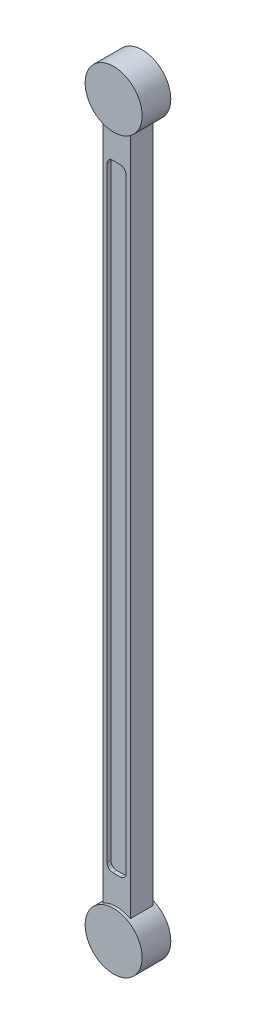
ISO-10303-21;
HEADER;
FILE_DESCRIPTION(('STEP AP214'),'2;1');
FILE_NAME('part.step','',(''),(''),'','','');
FILE_SCHEMA(('AUTOMOTIVE_DESIGN { 1 0 10303 214 1 1 1 1 }'));
ENDSEC;
DATA;
#1=APPLICATION_CONTEXT('core data for automotive mechanical design processes');
#2=APPLICATION_PROTOCOL_DEFINITION('international standard','automotive_design',2000,#1);
#3=PRODUCT_CONTEXT('',#1,'mechanical');
#4=PRODUCT('Part','Part','',(#3));
#5=PRODUCT_RELATED_PRODUCT_CATEGORY('part','',(#4));
#6=PRODUCT_DEFINITION_FORMATION('','',#4);
#7=PRODUCT_DEFINITION_CONTEXT('part definition',#1,'design');
#8=PRODUCT_DEFINITION('design','',#6,#7);
#9=PRODUCT_DEFINITION_SHAPE('','',#8);
#10=(LENGTH_UNIT() NAMED_UNIT(*) SI_UNIT(.MILLI.,.METRE.));
#11=(NAMED_UNIT(*) PLANE_ANGLE_UNIT() SI_UNIT($,.RADIAN.));
#12=(NAMED_UNIT(*) SI_UNIT($,.STERADIAN.) SOLID_ANGLE_UNIT());
#13=UNCERTAINTY_MEASURE_WITH_UNIT(LENGTH_MEASURE(1.E-05),#10,'distance_accuracy_value','');
#14=(GEOMETRIC_REPRESENTATION_CONTEXT(3) GLOBAL_UNCERTAINTY_ASSIGNED_CONTEXT((#13)) GLOBAL_UNIT_ASSIGNED_CONTEXT((#10,
#11,#12)) REPRESENTATION_CONTEXT('',''));
#15=CARTESIAN_POINT('',(0.,0.,0.));
#16=DIRECTION('',(0.,0.,1.));
#17=DIRECTION('',(1.,0.,0.));
#18=AXIS2_PLACEMENT_3D('',#15,#16,#17);
#19=CARTESIAN_POINT('',(0.,1219.99937354261,-19.0000000000001));
#20=DIRECTION('',(0.,0.,1.));
#21=DIRECTION('',(1.,0.,0.));
#22=AXIS2_PLACEMENT_3D('',#19,#20,#21);
#23=PLANE('',#22);
#24=DIRECTION('',(-1.,0.,0.));
#25=VECTOR('',#24,1.);
#26=CARTESIAN_POINT('',(6.23599999997874,93.9993735426106,-19.0000000000001));
#27=LINE('',#26,#25);
#28=CARTESIAN_POINT('',(6.23599999997874,93.9993735426106,-19.0000000000001));
#29=VERTEX_POINT('',#28);
#30=CARTESIAN_POINT('',(-6.23600000002361,93.9993735426106,-19.0000000000001));
#31=VERTEX_POINT('',#30);
#32=EDGE_CURVE('E206',#29,#31,#27,.T.);
#33=ORIENTED_EDGE('',*,*,#32,.F.);
#34=CARTESIAN_POINT('',(6.23599999997874,103.651373542611,-19.0000000000001));
#35=DIRECTION('',(0.,0.,-1.));
#36=DIRECTION('',(-1.,0.,0.));
#37=AXIS2_PLACEMENT_3D('',#34,#35,#36);
#38=CIRCLE('',#37,9.65199999999999);
#39=CARTESIAN_POINT('',(15.8879999999787,103.65137354261,-19.0000000000001));
#40=VERTEX_POINT('',#39);
#41=EDGE_CURVE('E54',#40,#29,#38,.T.);
#42=ORIENTED_EDGE('',*,*,#41,.F.);
#43=DIRECTION('',(0.,-1.,0.));
#44=VECTOR('',#43,1.);
#45=CARTESIAN_POINT('',(15.8879999999995,1116.34737354261,-19.0000000000001));
#46=LINE('',#45,#44);
#47=CARTESIAN_POINT('',(15.8879999999995,1116.34737354261,-19.0000000000001));
#48=VERTEX_POINT('',#47);
#49=EDGE_CURVE('E230',#48,#40,#46,.T.);
#50=ORIENTED_EDGE('',*,*,#49,.F.);
#51=CARTESIAN_POINT('',(6.23599999999932,1116.34737354261,-19.0000000000001));
#52=DIRECTION('',(0.,0.,-1.));
#53=DIRECTION('',(-1.,0.,0.));
#54=AXIS2_PLACEMENT_3D('',#51,#52,#53);
#55=CIRCLE('',#54,9.65200000000019);
#56=CARTESIAN_POINT('',(6.23599999999932,1125.99937354261,-19.0000000000001));
#57=VERTEX_POINT('',#56);
#58=EDGE_CURVE('E227',#57,#48,#55,.T.);
#59=ORIENTED_EDGE('',*,*,#58,.F.);
#60=DIRECTION('',(1.,0.,0.));
#61=VECTOR('',#60,1.);
#62=CARTESIAN_POINT('',(-6.23600000002362,1125.99937354261,-19.0000000000001));
#63=LINE('',#62,#61);
#64=CARTESIAN_POINT('',(-6.23600000002362,1125.99937354261,-19.0000000000001));
#65=VERTEX_POINT('',#64);
#66=EDGE_CURVE('E224',#65,#57,#63,.T.);
#67=ORIENTED_EDGE('',*,*,#66,.F.);
#68=CARTESIAN_POINT('',(-6.23600000002361,1116.34737354261,-19.0000000000001));
#69=DIRECTION('',(0.,0.,-1.));
#70=DIRECTION('',(-1.,0.,0.));
#71=AXIS2_PLACEMENT_3D('',#68,#69,#70);
#72=CIRCLE('',#71,9.652);
#73=CARTESIAN_POINT('',(-15.8880000000236,1116.34737354261,-19.0000000000001));
#74=VERTEX_POINT('',#73);
#75=EDGE_CURVE('E221',#74,#65,#72,.T.);
#76=ORIENTED_EDGE('',*,*,#75,.F.);
#77=DIRECTION('',(0.,1.,0.));
#78=VECTOR('',#77,1.);
#79=CARTESIAN_POINT('',(-15.8880000000236,103.651373542611,-19.0000000000001));
#80=LINE('',#79,#78);
#81=CARTESIAN_POINT('',(-15.8880000000236,103.651373542611,-19.0000000000001));
#82=VERTEX_POINT('',#81);
#83=EDGE_CURVE('E218',#82,#74,#80,.T.);
#84=ORIENTED_EDGE('',*,*,#83,.F.);
#85=CARTESIAN_POINT('',(-6.23600000002361,103.651373542611,-19.0000000000001));
#86=DIRECTION('',(0.,0.,-1.));
#87=DIRECTION('',(-1.,0.,0.));
#88=AXIS2_PLACEMENT_3D('',#85,#86,#87);
#89=CIRCLE('',#88,9.65199999999998);
#90=EDGE_CURVE('E215',#31,#82,#89,.T.);
#91=ORIENTED_EDGE('',*,*,#90,.F.);
#92=EDGE_LOOP('',(#33,#42,#50,#59,#67,#76,#84,#91));
#93=FACE_BOUND('',#92,.T.);
#94=CARTESIAN_POINT('',(0.,0.,-19.0000000000001));
#95=DIRECTION('',(0.,0.,1.));
#96=DIRECTION('',(1.,0.,0.));
#97=AXIS2_PLACEMENT_3D('',#94,#95,#96);
#98=CIRCLE('',#97,47.6571663267766);
#99=CARTESIAN_POINT('',(-23.0000000000236,41.7397352926078,-19.0000000000001));
#100=VERTEX_POINT('',#99);
#101=CARTESIAN_POINT('',(23.0000000000006,41.7397352926205,-19.0000000000001));
#102=VERTEX_POINT('',#101);
#103=EDGE_CURVE('E168',#100,#102,#98,.F.);
#104=ORIENTED_EDGE('',*,*,#103,.F.);
#105=DIRECTION('',(0.,-1.,0.));
#106=VECTOR('',#105,1.);
#107=CARTESIAN_POINT('',(-23.0000000000236,1178.25901179262,-19.0000000000001));
#108=LINE('',#107,#106);
#109=CARTESIAN_POINT('',(-23.0000000000236,1178.25901179262,-19.0000000000001));
#110=VERTEX_POINT('',#109);
#111=EDGE_CURVE('E177',#110,#100,#108,.T.);
#112=ORIENTED_EDGE('',*,*,#111,.F.);
#113=CARTESIAN_POINT('',(0.,1219.99937354261,-19.0000000000001));
#114=DIRECTION('',(0.,0.,1.));
#115=DIRECTION('',(1.,0.,0.));
#116=AXIS2_PLACEMENT_3D('',#113,#114,#115);
#117=CIRCLE('',#116,47.6577149999993);
#118=CARTESIAN_POINT('',(23.0000000000006,1178.25901179261,-19.0000000000001));
#119=VERTEX_POINT('',#118);
#120=EDGE_CURVE('E203',#119,#110,#117,.F.);
#121=ORIENTED_EDGE('',*,*,#120,.F.);
#122=DIRECTION('',(0.,1.,0.));
#123=VECTOR('',#122,1.);
#124=CARTESIAN_POINT('',(23.0000000000006,1178.25901179261,-19.0000000000001));
#125=LINE('',#124,#123);
#126=EDGE_CURVE('E178',#102,#119,#125,.T.);
#127=ORIENTED_EDGE('',*,*,#126,.F.);
#128=EDGE_LOOP('',(#104,#112,#121,#127));
#129=FACE_BOUND('',#128,.T.);
#130=ADVANCED_FACE('F32',(#93,#129),#23,.F.);
#131=CARTESIAN_POINT('',(0.,1219.99937354261,19.05));
#132=DIRECTION('',(0.,0.,1.));
#133=DIRECTION('',(1.,0.,0.));
#134=AXIS2_PLACEMENT_3D('',#131,#132,#133);
#135=PLANE('',#134);
#136=CARTESIAN_POINT('',(6.23599999997874,103.651373542611,19.05));
#137=DIRECTION('',(0.,0.,1.));
#138=DIRECTION('',(1.,0.,0.));
#139=AXIS2_PLACEMENT_3D('',#136,#137,#138);
#140=CIRCLE('',#139,9.65199999999999);
#141=CARTESIAN_POINT('',(6.23599999997874,93.9993735426106,19.05));
#142=VERTEX_POINT('',#141);
#143=CARTESIAN_POINT('',(15.8879999999787,103.65137354261,19.05));
#144=VERTEX_POINT('',#143);
#145=EDGE_CURVE('E260',#142,#144,#140,.T.);
#146=ORIENTED_EDGE('',*,*,#145,.F.);
#147=DIRECTION('',(1.,0.,0.));
#148=VECTOR('',#147,1.);
#149=CARTESIAN_POINT('',(-6.23600000002361,93.9993735426106,19.05));
#150=LINE('',#149,#148);
#151=CARTESIAN_POINT('',(-6.23600000002361,93.9993735426106,19.05));
#152=VERTEX_POINT('',#151);
#153=EDGE_CURVE('E293',#152,#142,#150,.T.);
#154=ORIENTED_EDGE('',*,*,#153,.F.);
#155=CARTESIAN_POINT('',(-6.23600000002361,103.651373542611,19.05));
#156=DIRECTION('',(0.,0.,1.));
#157=DIRECTION('',(-1.,0.,0.));
#158=AXIS2_PLACEMENT_3D('',#155,#156,#157);
#159=CIRCLE('',#158,9.65199999999999);
#160=CARTESIAN_POINT('',(-15.8880000000236,103.651373542611,19.05));
#161=VERTEX_POINT('',#160);
#162=EDGE_CURVE('E290',#161,#152,#159,.T.);
#163=ORIENTED_EDGE('',*,*,#162,.F.);
#164=DIRECTION('',(0.,-1.,0.));
#165=VECTOR('',#164,1.);
#166=CARTESIAN_POINT('',(-15.8880000000236,103.651373542611,19.05));
#167=LINE('',#166,#165);
#168=CARTESIAN_POINT('',(-15.8880000000236,1116.34737354261,19.05));
#169=VERTEX_POINT('',#168);
#170=EDGE_CURVE('E287',#169,#161,#167,.T.);
#171=ORIENTED_EDGE('',*,*,#170,.F.);
#172=CARTESIAN_POINT('',(-6.23600000002361,1116.34737354261,19.05));
#173=DIRECTION('',(0.,0.,1.));
#174=DIRECTION('',(1.,0.,0.));
#175=AXIS2_PLACEMENT_3D('',#172,#173,#174);
#176=CIRCLE('',#175,9.652);
#177=CARTESIAN_POINT('',(-6.23600000002361,1125.99937354261,19.05));
#178=VERTEX_POINT('',#177);
#179=EDGE_CURVE('E284',#178,#169,#176,.T.);
#180=ORIENTED_EDGE('',*,*,#179,.F.);
#181=DIRECTION('',(-1.,0.,0.));
#182=VECTOR('',#181,1.);
#183=CARTESIAN_POINT('',(-6.23600000002361,1125.99937354261,19.05));
#184=LINE('',#183,#182);
#185=CARTESIAN_POINT('',(6.23599999999932,1125.99937354261,19.05));
#186=VERTEX_POINT('',#185);
#187=EDGE_CURVE('E281',#186,#178,#184,.T.);
#188=ORIENTED_EDGE('',*,*,#187,.F.);
#189=CARTESIAN_POINT('',(6.23599999999932,1116.34737354261,19.05));
#190=DIRECTION('',(0.,0.,1.));
#191=DIRECTION('',(-1.,0.,0.));
#192=AXIS2_PLACEMENT_3D('',#189,#190,#191);
#193=CIRCLE('',#192,9.65200000000011);
#194=CARTESIAN_POINT('',(15.8879999999994,1116.34737354261,19.05));
#195=VERTEX_POINT('',#194);
#196=EDGE_CURVE('E278',#195,#186,#193,.T.);
#197=ORIENTED_EDGE('',*,*,#196,.F.);
#198=DIRECTION('',(0.,1.,0.));
#199=VECTOR('',#198,1.);
#200=CARTESIAN_POINT('',(15.8879999999993,1116.34737354261,19.05));
#201=LINE('',#200,#199);
#202=EDGE_CURVE('E275',#144,#195,#201,.T.);
#203=ORIENTED_EDGE('',*,*,#202,.F.);
#204=EDGE_LOOP('',(#146,#154,#163,#171,#180,#188,#197,#203));
#205=FACE_BOUND('',#204,.T.);
#206=DIRECTION('',(0.,-1.,0.));
#207=VECTOR('',#206,1.);
#208=CARTESIAN_POINT('',(-23.0000000000236,1178.25901179262,19.05));
#209=LINE('',#208,#207);
#210=CARTESIAN_POINT('',(-23.0000000000236,1178.25901179262,19.05));
#211=VERTEX_POINT('',#210);
#212=CARTESIAN_POINT('',(-23.0000000000236,41.7397352926079,19.05));
#213=VERTEX_POINT('',#212);
#214=EDGE_CURVE('E188',#211,#213,#209,.T.);
#215=ORIENTED_EDGE('',*,*,#214,.T.);
#216=CARTESIAN_POINT('',(0.,0.,19.05));
#217=DIRECTION('',(0.,0.,1.));
#218=DIRECTION('',(1.,0.,0.));
#219=AXIS2_PLACEMENT_3D('',#216,#217,#218);
#220=CIRCLE('',#219,47.6571663267766);
#221=CARTESIAN_POINT('',(23.0000000000006,41.7397352926205,19.05));
#222=VERTEX_POINT('',#221);
#223=EDGE_CURVE('E47',#213,#222,#220,.F.);
#224=ORIENTED_EDGE('',*,*,#223,.T.);
#225=DIRECTION('',(0.,1.,0.));
#226=VECTOR('',#225,1.);
#227=CARTESIAN_POINT('',(23.0000000000006,1178.25901179261,19.05));
#228=LINE('',#227,#226);
#229=CARTESIAN_POINT('',(23.0000000000006,1178.25901179261,19.05));
#230=VERTEX_POINT('',#229);
#231=EDGE_CURVE('E185',#222,#230,#228,.T.);
#232=ORIENTED_EDGE('',*,*,#231,.T.);
#233=CARTESIAN_POINT('',(0.,1219.99937354261,19.05));
#234=DIRECTION('',(0.,0.,1.));
#235=DIRECTION('',(1.,0.,0.));
#236=AXIS2_PLACEMENT_3D('',#233,#234,#235);
#237=CIRCLE('',#236,47.6577149999993);
#238=EDGE_CURVE('E40',#230,#211,#237,.F.);
#239=ORIENTED_EDGE('',*,*,#238,.T.);
#240=EDGE_LOOP('',(#215,#224,#232,#239));
#241=FACE_BOUND('',#240,.T.);
#242=ADVANCED_FACE('F198',(#205,#241),#135,.T.);
#243=CARTESIAN_POINT('',(23.0000000000006,1178.25901179261,-19.0000000000001));
#244=DIRECTION('',(1.,0.,0.));
#245=DIRECTION('',(0.,0.,-1.));
#246=AXIS2_PLACEMENT_3D('',#243,#244,#245);
#247=PLANE('',#246);
#248=ORIENTED_EDGE('',*,*,#231,.F.);
#249=DIRECTION('',(0.,0.,-1.));
#250=VECTOR('',#249,1.);
#251=CARTESIAN_POINT('',(23.0000000000006,41.7397352926205,23.876));
#252=LINE('',#251,#250);
#253=EDGE_CURVE('E179',#222,#102,#252,.T.);
#254=ORIENTED_EDGE('',*,*,#253,.T.);
#255=ORIENTED_EDGE('',*,*,#126,.T.);
#256=DIRECTION('',(0.,0.,1.));
#257=VECTOR('',#256,1.);
#258=CARTESIAN_POINT('',(23.0000000000006,1178.25901179261,-19.0000000000001));
#259=LINE('',#258,#257);
#260=EDGE_CURVE('E192',#119,#230,#259,.T.);
#261=ORIENTED_EDGE('',*,*,#260,.T.);
#262=EDGE_LOOP('',(#248,#254,#255,#261));
#263=FACE_BOUND('',#262,.T.);
#264=ADVANCED_FACE('F385',(#263),#247,.T.);
#265=CARTESIAN_POINT('',(-23.0000000000236,1178.25901179262,-19.0000000000001));
#266=DIRECTION('',(-1.,0.,0.));
#267=DIRECTION('',(0.,0.,1.));
#268=AXIS2_PLACEMENT_3D('',#265,#266,#267);
#269=PLANE('',#268);
#270=ORIENTED_EDGE('',*,*,#111,.T.);
#271=DIRECTION('',(0.,0.,-1.));
#272=VECTOR('',#271,1.);
#273=CARTESIAN_POINT('',(-23.0000000000236,41.7397352926078,23.876));
#274=LINE('',#273,#272);
#275=EDGE_CURVE('E11',#100,#213,#274,.F.);
#276=ORIENTED_EDGE('',*,*,#275,.T.);
#277=ORIENTED_EDGE('',*,*,#214,.F.);
#278=DIRECTION('',(0.,0.,1.));
#279=VECTOR('',#278,1.);
#280=CARTESIAN_POINT('',(-23.0000000000236,1178.25901179262,-19.0000000000001));
#281=LINE('',#280,#279);
#282=EDGE_CURVE('E184',#110,#211,#281,.T.);
#283=ORIENTED_EDGE('',*,*,#282,.F.);
#284=EDGE_LOOP('',(#270,#276,#277,#283));
#285=FACE_BOUND('',#284,.T.);
#286=ADVANCED_FACE('F182',(#285),#269,.T.);
#287=CARTESIAN_POINT('',(0.,1219.99937354261,-19.0000000000001));
#288=DIRECTION('',(0.,0.,1.));
#289=DIRECTION('',(1.,0.,0.));
#290=AXIS2_PLACEMENT_3D('',#287,#288,#289);
#291=CYLINDRICAL_SURFACE('',#290,47.6577149999993);
#292=ORIENTED_EDGE('',*,*,#282,.T.);
#293=ORIENTED_EDGE('',*,*,#238,.F.);
#294=ORIENTED_EDGE('',*,*,#260,.F.);
#295=ORIENTED_EDGE('',*,*,#120,.T.);
#296=EDGE_LOOP('',(#292,#293,#294,#295));
#297=FACE_BOUND('',#296,.T.);
#298=CARTESIAN_POINT('',(0.,1219.99937354261,23.876));
#299=DIRECTION('',(0.,0.,1.));
#300=DIRECTION('',(1.,0.,0.));
#301=AXIS2_PLACEMENT_3D('',#298,#299,#300);
#302=CIRCLE('',#301,47.6577149999993);
#303=CARTESIAN_POINT('',(47.6577149999993,1219.99937354261,23.876));
#304=VERTEX_POINT('',#303);
#305=EDGE_CURVE('E204',#304,#304,#302,.T.);
#306=ORIENTED_EDGE('',*,*,#305,.F.);
#307=EDGE_LOOP('',(#306));
#308=FACE_BOUND('',#307,.T.);
#309=CARTESIAN_POINT('',(0.,1219.99937354261,-24.13));
#310=DIRECTION('',(0.,0.,1.));
#311=DIRECTION('',(1.,0.,0.));
#312=AXIS2_PLACEMENT_3D('',#309,#310,#311);
#313=CIRCLE('',#312,47.6577149999993);
#314=CARTESIAN_POINT('',(47.6577149999993,1219.99937354261,-24.13));
#315=VERTEX_POINT('',#314);
#316=EDGE_CURVE('E209',#315,#315,#313,.T.);
#317=ORIENTED_EDGE('',*,*,#316,.T.);
#318=EDGE_LOOP('',(#317));
#319=FACE_BOUND('',#318,.T.);
#320=ADVANCED_FACE('F34',(#297,#308,#319),#291,.T.);
#321=CARTESIAN_POINT('',(6.23599999997874,103.651373542611,12.7));
#322=DIRECTION('',(0.,0.,1.));
#323=DIRECTION('',(1.,0.,0.));
#324=AXIS2_PLACEMENT_3D('',#321,#322,#323);
#325=CYLINDRICAL_SURFACE('',#324,9.65199999999999);
#326=ORIENTED_EDGE('',*,*,#145,.T.);
#327=DIRECTION('',(0.,0.,1.));
#328=VECTOR('',#327,1.);
#329=CARTESIAN_POINT('',(15.8879999999787,103.65137354261,12.7));
#330=LINE('',#329,#328);
#331=CARTESIAN_POINT('',(15.8879999999787,103.65137354261,12.7));
#332=VERTEX_POINT('',#331);
#333=EDGE_CURVE('E320',#332,#144,#330,.T.);
#334=ORIENTED_EDGE('',*,*,#333,.F.);
#335=CARTESIAN_POINT('',(6.23599999997874,103.651373542611,12.7));
#336=DIRECTION('',(0.,0.,1.));
#337=DIRECTION('',(1.,0.,0.));
#338=AXIS2_PLACEMENT_3D('',#335,#336,#337);
#339=CIRCLE('',#338,9.65199999999999);
#340=CARTESIAN_POINT('',(6.23599999997874,93.9993735426106,12.7));
#341=VERTEX_POINT('',#340);
#342=EDGE_CURVE('E296',#341,#332,#339,.T.);
#343=ORIENTED_EDGE('',*,*,#342,.F.);
#344=DIRECTION('',(0.,0.,1.));
#345=VECTOR('',#344,1.);
#346=CARTESIAN_POINT('',(6.23599999997874,93.9993735426106,12.7));
#347=LINE('',#346,#345);
#348=EDGE_CURVE('E321',#341,#142,#347,.T.);
#349=ORIENTED_EDGE('',*,*,#348,.T.);
#350=EDGE_LOOP('',(#326,#334,#343,#349));
#351=FACE_BOUND('',#350,.T.);
#352=ADVANCED_FACE('F355',(#351),#325,.F.);
#353=CARTESIAN_POINT('',(-6.23600000002361,93.9993735426106,12.7));
#354=DIRECTION('',(0.,-1.,0.));
#355=DIRECTION('',(1.,0.,0.));
#356=AXIS2_PLACEMENT_3D('',#353,#354,#355);
#357=PLANE('',#356);
#358=ORIENTED_EDGE('',*,*,#153,.T.);
#359=ORIENTED_EDGE('',*,*,#348,.F.);
#360=DIRECTION('',(1.,0.,0.));
#361=VECTOR('',#360,1.);
#362=CARTESIAN_POINT('',(-6.23600000002361,93.9993735426106,12.7));
#363=LINE('',#362,#361);
#364=CARTESIAN_POINT('',(-6.23600000002361,93.9993735426106,12.7));
#365=VERTEX_POINT('',#364);
#366=EDGE_CURVE('E317',#365,#341,#363,.T.);
#367=ORIENTED_EDGE('',*,*,#366,.F.);
#368=DIRECTION('',(0.,0.,1.));
#369=VECTOR('',#368,1.);
#370=CARTESIAN_POINT('',(-6.23600000002361,93.9993735426106,12.7));
#371=LINE('',#370,#369);
#372=EDGE_CURVE('E323',#365,#152,#371,.T.);
#373=ORIENTED_EDGE('',*,*,#372,.T.);
#374=EDGE_LOOP('',(#358,#359,#367,#373));
#375=FACE_BOUND('',#374,.T.);
#376=ADVANCED_FACE('F357',(#375),#357,.F.);
#377=CARTESIAN_POINT('',(-6.23600000002361,103.651373542611,12.7));
#378=DIRECTION('',(0.,0.,1.));
#379=DIRECTION('',(1.,0.,0.));
#380=AXIS2_PLACEMENT_3D('',#377,#378,#379);
#381=CYLINDRICAL_SURFACE('',#380,9.65199999999999);
#382=ORIENTED_EDGE('',*,*,#162,.T.);
#383=ORIENTED_EDGE('',*,*,#372,.F.);
#384=CARTESIAN_POINT('',(-6.23600000002361,103.651373542611,12.7));
#385=DIRECTION('',(0.,0.,1.));
#386=DIRECTION('',(-1.,0.,0.));
#387=AXIS2_PLACEMENT_3D('',#384,#385,#386);
#388=CIRCLE('',#387,9.65199999999999);
#389=CARTESIAN_POINT('',(-15.8880000000236,103.651373542611,12.7));
#390=VERTEX_POINT('',#389);
#391=EDGE_CURVE('E314',#390,#365,#388,.T.);
#392=ORIENTED_EDGE('',*,*,#391,.F.);
#393=DIRECTION('',(0.,0.,1.));
#394=VECTOR('',#393,1.);
#395=CARTESIAN_POINT('',(-15.8880000000236,103.651373542611,12.7));
#396=LINE('',#395,#394);
#397=EDGE_CURVE('E325',#390,#161,#396,.T.);
#398=ORIENTED_EDGE('',*,*,#397,.T.);
#399=EDGE_LOOP('',(#382,#383,#392,#398));
#400=FACE_BOUND('',#399,.T.);
#401=ADVANCED_FACE('F361',(#400),#381,.F.);
#402=CARTESIAN_POINT('',(-15.8880000000236,103.651373542611,12.7));
#403=DIRECTION('',(-1.,0.,0.));
#404=DIRECTION('',(0.,0.,1.));
#405=AXIS2_PLACEMENT_3D('',#402,#403,#404);
#406=PLANE('',#405);
#407=ORIENTED_EDGE('',*,*,#170,.T.);
#408=ORIENTED_EDGE('',*,*,#397,.F.);
#409=DIRECTION('',(0.,-1.,0.));
#410=VECTOR('',#409,1.);
#411=CARTESIAN_POINT('',(-15.8880000000236,103.651373542611,12.7));
#412=LINE('',#411,#410);
#413=CARTESIAN_POINT('',(-15.8880000000236,1116.34737354261,12.7));
#414=VERTEX_POINT('',#413);
#415=EDGE_CURVE('E311',#414,#390,#412,.T.);
#416=ORIENTED_EDGE('',*,*,#415,.F.);
#417=DIRECTION('',(0.,0.,1.));
#418=VECTOR('',#417,1.);
#419=CARTESIAN_POINT('',(-15.8880000000236,1116.34737354261,12.7));
#420=LINE('',#419,#418);
#421=EDGE_CURVE('E327',#414,#169,#420,.T.);
#422=ORIENTED_EDGE('',*,*,#421,.T.);
#423=EDGE_LOOP('',(#407,#408,#416,#422));
#424=FACE_BOUND('',#423,.T.);
#425=ADVANCED_FACE('F365',(#424),#406,.F.);
#426=CARTESIAN_POINT('',(-6.23600000002361,1116.34737354261,12.7));
#427=DIRECTION('',(0.,0.,1.));
#428=DIRECTION('',(1.,0.,0.));
#429=AXIS2_PLACEMENT_3D('',#426,#427,#428);
#430=CYLINDRICAL_SURFACE('',#429,9.652);
#431=ORIENTED_EDGE('',*,*,#179,.T.);
#432=ORIENTED_EDGE('',*,*,#421,.F.);
#433=CARTESIAN_POINT('',(-6.23600000002361,1116.34737354261,12.7));
#434=DIRECTION('',(0.,0.,1.));
#435=DIRECTION('',(1.,0.,0.));
#436=AXIS2_PLACEMENT_3D('',#433,#434,#435);
#437=CIRCLE('',#436,9.652);
#438=CARTESIAN_POINT('',(-6.23600000002361,1125.99937354261,12.7));
#439=VERTEX_POINT('',#438);
#440=EDGE_CURVE('E308',#439,#414,#437,.T.);
#441=ORIENTED_EDGE('',*,*,#440,.F.);
#442=DIRECTION('',(0.,0.,1.));
#443=VECTOR('',#442,1.);
#444=CARTESIAN_POINT('',(-6.23600000002361,1125.99937354261,12.7));
#445=LINE('',#444,#443);
#446=EDGE_CURVE('E329',#439,#178,#445,.T.);
#447=ORIENTED_EDGE('',*,*,#446,.T.);
#448=EDGE_LOOP('',(#431,#432,#441,#447));
#449=FACE_BOUND('',#448,.T.);
#450=ADVANCED_FACE('F368',(#449),#430,.F.);
#451=CARTESIAN_POINT('',(-6.23600000002361,1125.99937354261,12.7));
#452=DIRECTION('',(0.,1.,0.));
#453=DIRECTION('',(-1.,0.,0.));
#454=AXIS2_PLACEMENT_3D('',#451,#452,#453);
#455=PLANE('',#454);
#456=ORIENTED_EDGE('',*,*,#187,.T.);
#457=ORIENTED_EDGE('',*,*,#446,.F.);
#458=DIRECTION('',(-1.,0.,0.));
#459=VECTOR('',#458,1.);
#460=CARTESIAN_POINT('',(-6.23600000002361,1125.99937354261,12.7));
#461=LINE('',#460,#459);
#462=CARTESIAN_POINT('',(6.23599999999932,1125.99937354261,12.7));
#463=VERTEX_POINT('',#462);
#464=EDGE_CURVE('E305',#463,#439,#461,.T.);
#465=ORIENTED_EDGE('',*,*,#464,.F.);
#466=DIRECTION('',(0.,0.,1.));
#467=VECTOR('',#466,1.);
#468=CARTESIAN_POINT('',(6.23599999999932,1125.99937354261,12.7));
#469=LINE('',#468,#467);
#470=EDGE_CURVE('E331',#463,#186,#469,.T.);
#471=ORIENTED_EDGE('',*,*,#470,.T.);
#472=EDGE_LOOP('',(#456,#457,#465,#471));
#473=FACE_BOUND('',#472,.T.);
#474=ADVANCED_FACE('F370',(#473),#455,.F.);
#475=CARTESIAN_POINT('',(6.23599999999932,1116.34737354261,12.7));
#476=DIRECTION('',(0.,0.,1.));
#477=DIRECTION('',(1.,0.,0.));
#478=AXIS2_PLACEMENT_3D('',#475,#476,#477);
#479=CYLINDRICAL_SURFACE('',#478,9.65200000000011);
#480=ORIENTED_EDGE('',*,*,#196,.T.);
#481=ORIENTED_EDGE('',*,*,#470,.F.);
#482=CARTESIAN_POINT('',(6.23599999999932,1116.34737354261,12.7));
#483=DIRECTION('',(0.,0.,1.));
#484=DIRECTION('',(-1.,0.,0.));
#485=AXIS2_PLACEMENT_3D('',#482,#483,#484);
#486=CIRCLE('',#485,9.65200000000011);
#487=CARTESIAN_POINT('',(15.8879999999994,1116.34737354261,12.7));
#488=VERTEX_POINT('',#487);
#489=EDGE_CURVE('E302',#488,#463,#486,.T.);
#490=ORIENTED_EDGE('',*,*,#489,.F.);
#491=DIRECTION('',(0.,0.,1.));
#492=VECTOR('',#491,1.);
#493=CARTESIAN_POINT('',(15.8879999999994,1116.34737354261,12.7));
#494=LINE('',#493,#492);
#495=EDGE_CURVE('E333',#488,#195,#494,.T.);
#496=ORIENTED_EDGE('',*,*,#495,.T.);
#497=EDGE_LOOP('',(#480,#481,#490,#496));
#498=FACE_BOUND('',#497,.T.);
#499=ADVANCED_FACE('F349',(#498),#479,.F.);
#500=CARTESIAN_POINT('',(15.8879999999993,1116.34737354261,12.7));
#501=DIRECTION('',(1.,0.,0.));
#502=DIRECTION('',(0.,1.,0.));
#503=AXIS2_PLACEMENT_3D('',#500,#501,#502);
#504=PLANE('',#503);
#505=ORIENTED_EDGE('',*,*,#202,.T.);
#506=ORIENTED_EDGE('',*,*,#495,.F.);
#507=DIRECTION('',(0.,1.,0.));
#508=VECTOR('',#507,1.);
#509=CARTESIAN_POINT('',(15.8879999999993,1116.34737354261,12.7));
#510=LINE('',#509,#508);
#511=EDGE_CURVE('E299',#332,#488,#510,.T.);
#512=ORIENTED_EDGE('',*,*,#511,.F.);
#513=ORIENTED_EDGE('',*,*,#333,.T.);
#514=EDGE_LOOP('',(#505,#506,#512,#513));
#515=FACE_BOUND('',#514,.T.);
#516=ADVANCED_FACE('F339',(#515),#504,.F.);
#517=CARTESIAN_POINT('',(6.23599999997874,103.651373542611,12.7));
#518=DIRECTION('',(0.,0.,1.));
#519=DIRECTION('',(1.,0.,0.));
#520=AXIS2_PLACEMENT_3D('',#517,#518,#519);
#521=PLANE('',#520);
#522=ORIENTED_EDGE('',*,*,#342,.T.);
#523=ORIENTED_EDGE('',*,*,#511,.T.);
#524=ORIENTED_EDGE('',*,*,#489,.T.);
#525=ORIENTED_EDGE('',*,*,#464,.T.);
#526=ORIENTED_EDGE('',*,*,#440,.T.);
#527=ORIENTED_EDGE('',*,*,#415,.T.);
#528=ORIENTED_EDGE('',*,*,#391,.T.);
#529=ORIENTED_EDGE('',*,*,#366,.T.);
#530=EDGE_LOOP('',(#522,#523,#524,#525,#526,#527,#528,#529));
#531=FACE_BOUND('',#530,.T.);
#532=ADVANCED_FACE('F353',(#531),#521,.T.);
#533=CARTESIAN_POINT('',(6.23599999997874,103.651373542611,-12.6500000000001));
#534=DIRECTION('',(0.,0.,-1.));
#535=DIRECTION('',(-1.,0.,0.));
#536=AXIS2_PLACEMENT_3D('',#533,#534,#535);
#537=CYLINDRICAL_SURFACE('',#536,9.65199999999999);
#538=ORIENTED_EDGE('',*,*,#41,.T.);
#539=DIRECTION('',(0.,0.,-1.));
#540=VECTOR('',#539,1.);
#541=CARTESIAN_POINT('',(6.23599999997874,93.9993735426106,-12.6500000000001));
#542=LINE('',#541,#540);
#543=CARTESIAN_POINT('',(6.23599999997874,93.9993735426106,-12.6500000000001));
#544=VERTEX_POINT('',#543);
#545=EDGE_CURVE('E257',#544,#29,#542,.T.);
#546=ORIENTED_EDGE('',*,*,#545,.F.);
#547=CARTESIAN_POINT('',(6.23599999997874,103.651373542611,-12.6500000000001));
#548=DIRECTION('',(0.,0.,-1.));
#549=DIRECTION('',(-1.,0.,0.));
#550=AXIS2_PLACEMENT_3D('',#547,#548,#549);
#551=CIRCLE('',#550,9.65199999999999);
#552=CARTESIAN_POINT('',(15.8879999999787,103.65137354261,-12.6500000000001));
#553=VERTEX_POINT('',#552);
#554=EDGE_CURVE('E233',#553,#544,#551,.T.);
#555=ORIENTED_EDGE('',*,*,#554,.F.);
#556=DIRECTION('',(0.,0.,-1.));
#557=VECTOR('',#556,1.);
#558=CARTESIAN_POINT('',(15.8879999999787,103.65137354261,-12.6500000000001));
#559=LINE('',#558,#557);
#560=EDGE_CURVE('E258',#553,#40,#559,.T.);
#561=ORIENTED_EDGE('',*,*,#560,.T.);
#562=EDGE_LOOP('',(#538,#546,#555,#561));
#563=FACE_BOUND('',#562,.T.);
#564=ADVANCED_FACE('F408',(#563),#537,.F.);
#565=CARTESIAN_POINT('',(15.8879999999995,1116.34737354261,-12.6500000000001));
#566=DIRECTION('',(1.,0.,0.));
#567=DIRECTION('',(0.,1.,0.));
#568=AXIS2_PLACEMENT_3D('',#565,#566,#567);
#569=PLANE('',#568);
#570=ORIENTED_EDGE('',*,*,#49,.T.);
#571=ORIENTED_EDGE('',*,*,#560,.F.);
#572=DIRECTION('',(0.,-1.,0.));
#573=VECTOR('',#572,1.);
#574=CARTESIAN_POINT('',(15.8879999999995,1116.34737354261,-12.6500000000001));
#575=LINE('',#574,#573);
#576=CARTESIAN_POINT('',(15.8879999999995,1116.34737354261,-12.6500000000001));
#577=VERTEX_POINT('',#576);
#578=EDGE_CURVE('E254',#577,#553,#575,.T.);
#579=ORIENTED_EDGE('',*,*,#578,.F.);
#580=DIRECTION('',(0.,0.,-1.));
#581=VECTOR('',#580,1.);
#582=CARTESIAN_POINT('',(15.8879999999995,1116.34737354261,-12.6500000000001));
#583=LINE('',#582,#581);
#584=EDGE_CURVE('E261',#577,#48,#583,.T.);
#585=ORIENTED_EDGE('',*,*,#584,.T.);
#586=EDGE_LOOP('',(#570,#571,#579,#585));
#587=FACE_BOUND('',#586,.T.);
#588=ADVANCED_FACE('F413',(#587),#569,.F.);
#589=CARTESIAN_POINT('',(6.23599999999932,1116.34737354261,-12.6500000000001));
#590=DIRECTION('',(0.,0.,-1.));
#591=DIRECTION('',(-1.,0.,0.));
#592=AXIS2_PLACEMENT_3D('',#589,#590,#591);
#593=CYLINDRICAL_SURFACE('',#592,9.65200000000019);
#594=ORIENTED_EDGE('',*,*,#58,.T.);
#595=ORIENTED_EDGE('',*,*,#584,.F.);
#596=CARTESIAN_POINT('',(6.23599999999932,1116.34737354261,-12.6500000000001));
#597=DIRECTION('',(0.,0.,-1.));
#598=DIRECTION('',(-1.,0.,0.));
#599=AXIS2_PLACEMENT_3D('',#596,#597,#598);
#600=CIRCLE('',#599,9.65200000000019);
#601=CARTESIAN_POINT('',(6.23599999999932,1125.99937354261,-12.6500000000001));
#602=VERTEX_POINT('',#601);
#603=EDGE_CURVE('E251',#602,#577,#600,.T.);
#604=ORIENTED_EDGE('',*,*,#603,.F.);
#605=DIRECTION('',(0.,0.,-1.));
#606=VECTOR('',#605,1.);
#607=CARTESIAN_POINT('',(6.23599999999932,1125.99937354261,-12.6500000000001));
#608=LINE('',#607,#606);
#609=EDGE_CURVE('E263',#602,#57,#608,.T.);
#610=ORIENTED_EDGE('',*,*,#609,.T.);
#611=EDGE_LOOP('',(#594,#595,#604,#610));
#612=FACE_BOUND('',#611,.T.);
#613=ADVANCED_FACE('F461',(#612),#593,.F.);
#614=CARTESIAN_POINT('',(-6.23600000002362,1125.99937354261,-12.6500000000001));
#615=DIRECTION('',(0.,1.,0.));
#616=DIRECTION('',(-1.,0.,0.));
#617=AXIS2_PLACEMENT_3D('',#614,#615,#616);
#618=PLANE('',#617);
#619=ORIENTED_EDGE('',*,*,#66,.T.);
#620=ORIENTED_EDGE('',*,*,#609,.F.);
#621=DIRECTION('',(1.,0.,0.));
#622=VECTOR('',#621,1.);
#623=CARTESIAN_POINT('',(-6.23600000002362,1125.99937354261,-12.6500000000001));
#624=LINE('',#623,#622);
#625=CARTESIAN_POINT('',(-6.23600000002362,1125.99937354261,-12.6500000000001));
#626=VERTEX_POINT('',#625);
#627=EDGE_CURVE('E248',#626,#602,#624,.T.);
#628=ORIENTED_EDGE('',*,*,#627,.F.);
#629=DIRECTION('',(0.,0.,-1.));
#630=VECTOR('',#629,1.);
#631=CARTESIAN_POINT('',(-6.23600000002362,1125.99937354261,-12.6500000000001));
#632=LINE('',#631,#630);
#633=EDGE_CURVE('E265',#626,#65,#632,.T.);
#634=ORIENTED_EDGE('',*,*,#633,.T.);
#635=EDGE_LOOP('',(#619,#620,#628,#634));
#636=FACE_BOUND('',#635,.T.);
#637=ADVANCED_FACE('F471',(#636),#618,.F.);
#638=CARTESIAN_POINT('',(-6.23600000002361,1116.34737354261,-12.6500000000001));
#639=DIRECTION('',(0.,0.,-1.));
#640=DIRECTION('',(-1.,0.,0.));
#641=AXIS2_PLACEMENT_3D('',#638,#639,#640);
#642=CYLINDRICAL_SURFACE('',#641,9.652);
#643=ORIENTED_EDGE('',*,*,#75,.T.);
#644=ORIENTED_EDGE('',*,*,#633,.F.);
#645=CARTESIAN_POINT('',(-6.23600000002361,1116.34737354261,-12.6500000000001));
#646=DIRECTION('',(0.,0.,-1.));
#647=DIRECTION('',(-1.,0.,0.));
#648=AXIS2_PLACEMENT_3D('',#645,#646,#647);
#649=CIRCLE('',#648,9.652);
#650=CARTESIAN_POINT('',(-15.8880000000236,1116.34737354261,-12.6500000000001));
#651=VERTEX_POINT('',#650);
#652=EDGE_CURVE('E245',#651,#626,#649,.T.);
#653=ORIENTED_EDGE('',*,*,#652,.F.);
#654=DIRECTION('',(0.,0.,-1.));
#655=VECTOR('',#654,1.);
#656=CARTESIAN_POINT('',(-15.8880000000236,1116.34737354261,-12.6500000000001));
#657=LINE('',#656,#655);
#658=EDGE_CURVE('E267',#651,#74,#657,.T.);
#659=ORIENTED_EDGE('',*,*,#658,.T.);
#660=EDGE_LOOP('',(#643,#644,#653,#659));
#661=FACE_BOUND('',#660,.T.);
#662=ADVANCED_FACE('F481',(#661),#642,.F.);
#663=CARTESIAN_POINT('',(-15.8880000000236,103.651373542611,-12.6500000000001));
#664=DIRECTION('',(-1.,0.,0.));
#665=DIRECTION('',(0.,-1.,0.));
#666=AXIS2_PLACEMENT_3D('',#663,#664,#665);
#667=PLANE('',#666);
#668=ORIENTED_EDGE('',*,*,#83,.T.);
#669=ORIENTED_EDGE('',*,*,#658,.F.);
#670=DIRECTION('',(0.,1.,0.));
#671=VECTOR('',#670,1.);
#672=CARTESIAN_POINT('',(-15.8880000000236,103.651373542611,-12.6500000000001));
#673=LINE('',#672,#671);
#674=CARTESIAN_POINT('',(-15.8880000000236,103.651373542611,-12.6500000000001));
#675=VERTEX_POINT('',#674);
#676=EDGE_CURVE('E242',#675,#651,#673,.T.);
#677=ORIENTED_EDGE('',*,*,#676,.F.);
#678=DIRECTION('',(0.,0.,-1.));
#679=VECTOR('',#678,1.);
#680=CARTESIAN_POINT('',(-15.8880000000236,103.651373542611,-12.6500000000001));
#681=LINE('',#680,#679);
#682=EDGE_CURVE('E269',#675,#82,#681,.T.);
#683=ORIENTED_EDGE('',*,*,#682,.T.);
#684=EDGE_LOOP('',(#668,#669,#677,#683));
#685=FACE_BOUND('',#684,.T.);
#686=ADVANCED_FACE('F491',(#685),#667,.F.);
#687=CARTESIAN_POINT('',(-6.23600000002361,103.651373542611,-12.6500000000001));
#688=DIRECTION('',(0.,0.,-1.));
#689=DIRECTION('',(-1.,0.,0.));
#690=AXIS2_PLACEMENT_3D('',#687,#688,#689);
#691=CYLINDRICAL_SURFACE('',#690,9.65199999999998);
#692=ORIENTED_EDGE('',*,*,#90,.T.);
#693=ORIENTED_EDGE('',*,*,#682,.F.);
#694=CARTESIAN_POINT('',(-6.23600000002361,103.651373542611,-12.6500000000001));
#695=DIRECTION('',(0.,0.,-1.));
#696=DIRECTION('',(-1.,0.,0.));
#697=AXIS2_PLACEMENT_3D('',#694,#695,#696);
#698=CIRCLE('',#697,9.65199999999998);
#699=CARTESIAN_POINT('',(-6.23600000002361,93.9993735426106,-12.6500000000001));
#700=VERTEX_POINT('',#699);
#701=EDGE_CURVE('E239',#700,#675,#698,.T.);
#702=ORIENTED_EDGE('',*,*,#701,.F.);
#703=DIRECTION('',(0.,0.,-1.));
#704=VECTOR('',#703,1.);
#705=CARTESIAN_POINT('',(-6.23600000002361,93.9993735426106,-12.6500000000001));
#706=LINE('',#705,#704);
#707=EDGE_CURVE('E271',#700,#31,#706,.T.);
#708=ORIENTED_EDGE('',*,*,#707,.T.);
#709=EDGE_LOOP('',(#692,#693,#702,#708));
#710=FACE_BOUND('',#709,.T.);
#711=ADVANCED_FACE('F501',(#710),#691,.F.);
#712=CARTESIAN_POINT('',(6.23599999997874,93.9993735426106,-12.6500000000001));
#713=DIRECTION('',(0.,-1.,0.));
#714=DIRECTION('',(1.,0.,0.));
#715=AXIS2_PLACEMENT_3D('',#712,#713,#714);
#716=PLANE('',#715);
#717=ORIENTED_EDGE('',*,*,#32,.T.);
#718=ORIENTED_EDGE('',*,*,#707,.F.);
#719=DIRECTION('',(-1.,0.,0.));
#720=VECTOR('',#719,1.);
#721=CARTESIAN_POINT('',(6.23599999997874,93.9993735426106,-12.6500000000001));
#722=LINE('',#721,#720);
#723=EDGE_CURVE('E236',#544,#700,#722,.T.);
#724=ORIENTED_EDGE('',*,*,#723,.F.);
#725=ORIENTED_EDGE('',*,*,#545,.T.);
#726=EDGE_LOOP('',(#717,#718,#724,#725));
#727=FACE_BOUND('',#726,.T.);
#728=ADVANCED_FACE('F511',(#727),#716,.F.);
#729=CARTESIAN_POINT('',(6.23599999997874,103.651373542611,-12.6500000000001));
#730=DIRECTION('',(0.,0.,-1.));
#731=DIRECTION('',(-1.,0.,0.));
#732=AXIS2_PLACEMENT_3D('',#729,#730,#731);
#733=PLANE('',#732);
#734=ORIENTED_EDGE('',*,*,#554,.T.);
#735=ORIENTED_EDGE('',*,*,#723,.T.);
#736=ORIENTED_EDGE('',*,*,#701,.T.);
#737=ORIENTED_EDGE('',*,*,#676,.T.);
#738=ORIENTED_EDGE('',*,*,#652,.T.);
#739=ORIENTED_EDGE('',*,*,#627,.T.);
#740=ORIENTED_EDGE('',*,*,#603,.T.);
#741=ORIENTED_EDGE('',*,*,#578,.T.);
#742=EDGE_LOOP('',(#734,#735,#736,#737,#738,#739,#740,#741));
#743=FACE_BOUND('',#742,.T.);
#744=ADVANCED_FACE('F521',(#743),#733,.T.);
#745=CARTESIAN_POINT('',(0.,1219.99937354261,23.876));
#746=DIRECTION('',(0.,0.,1.));
#747=DIRECTION('',(1.,0.,0.));
#748=AXIS2_PLACEMENT_3D('',#745,#746,#747);
#749=PLANE('',#748);
#750=ORIENTED_EDGE('',*,*,#305,.T.);
#751=EDGE_LOOP('',(#750));
#752=FACE_BOUND('',#751,.T.);
#753=ADVANCED_FACE('F529',(#752),#749,.T.);
#754=CARTESIAN_POINT('',(0.,1219.99937354261,-24.13));
#755=DIRECTION('',(0.,0.,1.));
#756=DIRECTION('',(1.,0.,0.));
#757=AXIS2_PLACEMENT_3D('',#754,#755,#756);
#758=PLANE('',#757);
#759=ORIENTED_EDGE('',*,*,#316,.F.);
#760=EDGE_LOOP('',(#759));
#761=FACE_BOUND('',#760,.T.);
#762=ADVANCED_FACE('F565',(#761),#758,.F.);
#763=CARTESIAN_POINT('',(0.,0.,23.876));
#764=DIRECTION('',(0.,0.,-1.));
#765=DIRECTION('',(-1.,0.,0.));
#766=AXIS2_PLACEMENT_3D('',#763,#764,#765);
#767=CYLINDRICAL_SURFACE('',#766,47.6571663267766);
#768=ORIENTED_EDGE('',*,*,#253,.F.);
#769=ORIENTED_EDGE('',*,*,#223,.F.);
#770=ORIENTED_EDGE('',*,*,#275,.F.);
#771=ORIENTED_EDGE('',*,*,#103,.T.);
#772=EDGE_LOOP('',(#768,#769,#770,#771));
#773=FACE_BOUND('',#772,.T.);
#774=CARTESIAN_POINT('',(0.,0.,23.876));
#775=DIRECTION('',(0.,0.,1.));
#776=DIRECTION('',(1.,0.,0.));
#777=AXIS2_PLACEMENT_3D('',#774,#775,#776);
#778=CIRCLE('',#777,47.6571663267766);
#779=CARTESIAN_POINT('',(47.6571663267766,0.,23.876));
#780=VERTEX_POINT('',#779);
#781=EDGE_CURVE('E611',#780,#780,#778,.T.);
#782=ORIENTED_EDGE('',*,*,#781,.F.);
#783=EDGE_LOOP('',(#782));
#784=FACE_BOUND('',#783,.T.);
#785=CARTESIAN_POINT('',(0.,0.,-24.13));
#786=DIRECTION('',(0.,0.,1.));
#787=DIRECTION('',(1.,0.,0.));
#788=AXIS2_PLACEMENT_3D('',#785,#786,#787);
#789=CIRCLE('',#788,47.6571663267766);
#790=CARTESIAN_POINT('',(47.6571663267766,0.,-24.13));
#791=VERTEX_POINT('',#790);
#792=EDGE_CURVE('E609',#791,#791,#789,.T.);
#793=ORIENTED_EDGE('',*,*,#792,.T.);
#794=EDGE_LOOP('',(#793));
#795=FACE_BOUND('',#794,.T.);
#796=ADVANCED_FACE('F166',(#773,#784,#795),#767,.T.);
#797=CARTESIAN_POINT('',(0.,0.,23.876));
#798=DIRECTION('',(0.,0.,1.));
#799=DIRECTION('',(1.,0.,0.));
#800=AXIS2_PLACEMENT_3D('',#797,#798,#799);
#801=PLANE('',#800);
#802=ORIENTED_EDGE('',*,*,#781,.T.);
#803=EDGE_LOOP('',(#802));
#804=FACE_BOUND('',#803,.T.);
#805=ADVANCED_FACE('F584',(#804),#801,.T.);
#806=CARTESIAN_POINT('',(0.,0.,-24.13));
#807=DIRECTION('',(0.,0.,1.));
#808=DIRECTION('',(1.,0.,0.));
#809=AXIS2_PLACEMENT_3D('',#806,#807,#808);
#810=PLANE('',#809);
#811=ORIENTED_EDGE('',*,*,#792,.F.);
#812=EDGE_LOOP('',(#811));
#813=FACE_BOUND('',#812,.T.);
#814=ADVANCED_FACE('F593',(#813),#810,.F.);
#815=CLOSED_SHELL('',(#130,#242,#264,#286,#320,#352,#376,#401,#425,#450,#474,#499,#516,#532,
#564,#588,#613,#637,#662,#686,#711,#728,#744,#753,#762,#796,#805,#814));
#816=MANIFOLD_SOLID_BREP('B2',#815);
#817=ADVANCED_BREP_SHAPE_REPRESENTATION('',(#18,#816),#14);
#818=SHAPE_DEFINITION_REPRESENTATION(#9,#817);
ENDSEC;
END-ISO-10303-21;
